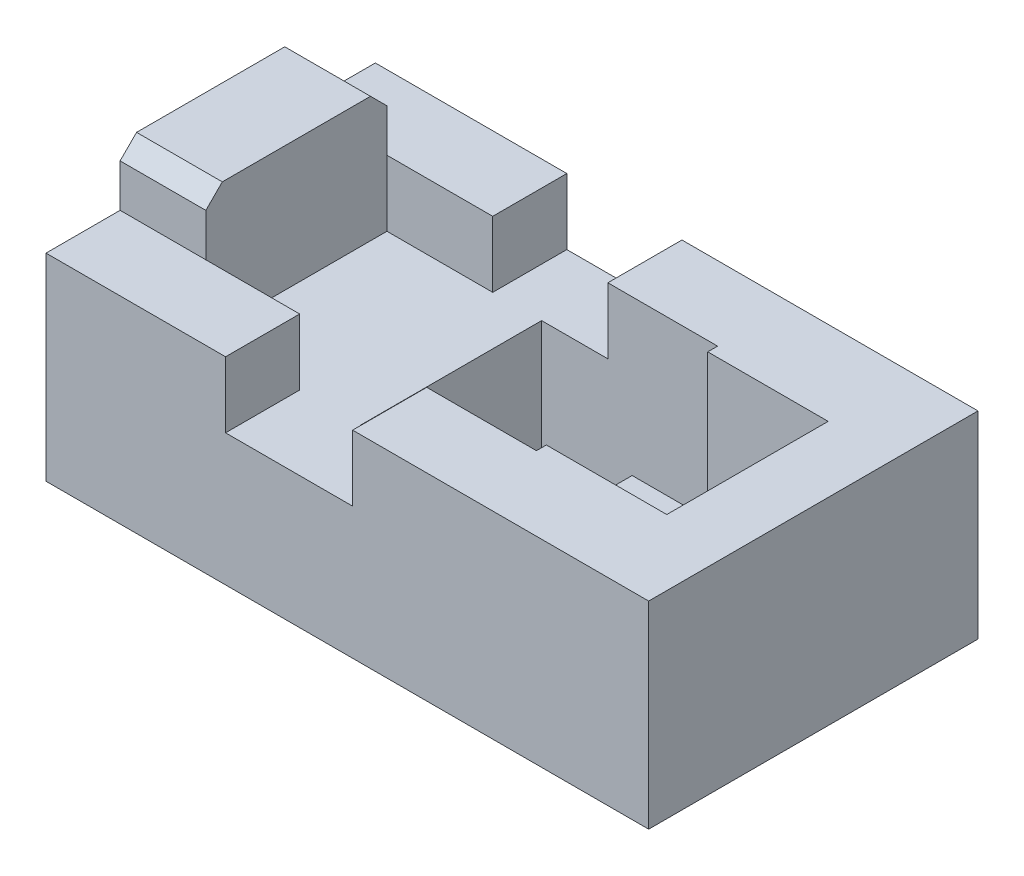
ISO-10303-21;
HEADER;
FILE_DESCRIPTION(('STEP AP214'),'2;1');
FILE_NAME('part.step','',(''),(''),'','','');
FILE_SCHEMA(('AUTOMOTIVE_DESIGN { 1 0 10303 214 1 1 1 1 }'));
ENDSEC;
DATA;
#1=APPLICATION_CONTEXT('core data for automotive mechanical design processes');
#2=APPLICATION_PROTOCOL_DEFINITION('international standard','automotive_design',2000,#1);
#3=PRODUCT_CONTEXT('',#1,'mechanical');
#4=PRODUCT('Part','Part','',(#3));
#5=PRODUCT_RELATED_PRODUCT_CATEGORY('part','',(#4));
#6=PRODUCT_DEFINITION_FORMATION('','',#4);
#7=PRODUCT_DEFINITION_CONTEXT('part definition',#1,'design');
#8=PRODUCT_DEFINITION('design','',#6,#7);
#9=PRODUCT_DEFINITION_SHAPE('','',#8);
#10=(LENGTH_UNIT() NAMED_UNIT(*) SI_UNIT(.MILLI.,.METRE.));
#11=(NAMED_UNIT(*) PLANE_ANGLE_UNIT() SI_UNIT($,.RADIAN.));
#12=(NAMED_UNIT(*) SI_UNIT($,.STERADIAN.) SOLID_ANGLE_UNIT());
#13=UNCERTAINTY_MEASURE_WITH_UNIT(LENGTH_MEASURE(1.E-05),#10,'distance_accuracy_value','');
#14=(GEOMETRIC_REPRESENTATION_CONTEXT(3) GLOBAL_UNCERTAINTY_ASSIGNED_CONTEXT((#13)) GLOBAL_UNIT_ASSIGNED_CONTEXT((#10,
#11,#12)) REPRESENTATION_CONTEXT('',''));
#15=CARTESIAN_POINT('',(0.,0.,0.));
#16=DIRECTION('',(0.,0.,1.));
#17=DIRECTION('',(1.,0.,0.));
#18=AXIS2_PLACEMENT_3D('',#15,#16,#17);
#19=CARTESIAN_POINT('',(0.,0.,0.));
#20=DIRECTION('',(0.,-1.,0.));
#21=DIRECTION('',(0.,0.,-1.));
#22=AXIS2_PLACEMENT_3D('',#19,#20,#21);
#23=PLANE('',#22);
#24=DIRECTION('',(0.,0.,1.));
#25=VECTOR('',#24,1.);
#26=CARTESIAN_POINT('',(0.750000000000002,0.,-2.75));
#27=LINE('',#26,#25);
#28=CARTESIAN_POINT('',(0.750000000000002,0.,-2.75));
#29=VERTEX_POINT('',#28);
#30=CARTESIAN_POINT('',(0.750000000000003,0.,2.75));
#31=VERTEX_POINT('',#30);
#32=EDGE_CURVE('E485',#29,#31,#27,.T.);
#33=ORIENTED_EDGE('',*,*,#32,.T.);
#34=DIRECTION('',(1.,0.,0.));
#35=VECTOR('',#34,1.);
#36=CARTESIAN_POINT('',(0.750000000000003,0.,2.75));
#37=LINE('',#36,#35);
#38=CARTESIAN_POINT('',(2.49790103791758,0.,2.75));
#39=VERTEX_POINT('',#38);
#40=EDGE_CURVE('E489',#31,#39,#37,.T.);
#41=ORIENTED_EDGE('',*,*,#40,.T.);
#42=DIRECTION('',(0.,0.,-1.));
#43=VECTOR('',#42,1.);
#44=CARTESIAN_POINT('',(2.49790103791758,0.,-2.75));
#45=LINE('',#44,#43);
#46=CARTESIAN_POINT('',(2.49790103791758,0.,-2.75));
#47=VERTEX_POINT('',#46);
#48=EDGE_CURVE('E493',#39,#47,#45,.T.);
#49=ORIENTED_EDGE('',*,*,#48,.T.);
#50=DIRECTION('',(-1.,0.,0.));
#51=VECTOR('',#50,1.);
#52=CARTESIAN_POINT('',(0.750000000000002,0.,-2.75));
#53=LINE('',#52,#51);
#54=EDGE_CURVE('E497',#47,#29,#53,.T.);
#55=ORIENTED_EDGE('',*,*,#54,.T.);
#56=EDGE_LOOP('',(#33,#41,#49,#55));
#57=FACE_BOUND('',#56,.T.);
#58=DIRECTION('',(1.,0.,0.));
#59=VECTOR('',#58,1.);
#60=CARTESIAN_POINT('',(-9.75,0.,5.));
#61=LINE('',#60,#59);
#62=CARTESIAN_POINT('',(-6.55,0.,5.));
#63=VERTEX_POINT('',#62);
#64=CARTESIAN_POINT('',(11.75,0.,5.));
#65=VERTEX_POINT('',#64);
#66=EDGE_CURVE('E550',#63,#65,#61,.T.);
#67=ORIENTED_EDGE('',*,*,#66,.F.);
#68=DIRECTION('',(0.,0.,-1.));
#69=VECTOR('',#68,1.);
#70=CARTESIAN_POINT('',(-6.55,0.,-5.));
#71=LINE('',#70,#69);
#72=CARTESIAN_POINT('',(-6.55,0.,-5.));
#73=VERTEX_POINT('',#72);
#74=EDGE_CURVE('E510',#63,#73,#71,.T.);
#75=ORIENTED_EDGE('',*,*,#74,.T.);
#76=DIRECTION('',(-1.,0.,0.));
#77=VECTOR('',#76,1.);
#78=CARTESIAN_POINT('',(-9.75,0.,-5.));
#79=LINE('',#78,#77);
#80=CARTESIAN_POINT('',(11.75,0.,-5.));
#81=VERTEX_POINT('',#80);
#82=EDGE_CURVE('E541',#81,#73,#79,.T.);
#83=ORIENTED_EDGE('',*,*,#82,.F.);
#84=DIRECTION('',(0.,0.,-1.));
#85=VECTOR('',#84,1.);
#86=CARTESIAN_POINT('',(11.75,0.,-5.));
#87=LINE('',#86,#85);
#88=EDGE_CURVE('E481',#65,#81,#87,.T.);
#89=ORIENTED_EDGE('',*,*,#88,.F.);
#90=EDGE_LOOP('',(#67,#75,#83,#89));
#91=FACE_BOUND('',#90,.T.);
#92=ADVANCED_FACE('F45',(#57,#91),#23,.T.);
#93=CARTESIAN_POINT('',(0.,4.,0.));
#94=DIRECTION('',(0.,-1.,0.));
#95=DIRECTION('',(0.,0.,-1.));
#96=AXIS2_PLACEMENT_3D('',#93,#94,#95);
#97=PLANE('',#96);
#98=DIRECTION('',(0.,0.,-1.));
#99=VECTOR('',#98,1.);
#100=CARTESIAN_POINT('',(-3.94664085234808,4.,-2.75));
#101=LINE('',#100,#99);
#102=CARTESIAN_POINT('',(-3.94664085234808,4.,2.75));
#103=VERTEX_POINT('',#102);
#104=CARTESIAN_POINT('',(-3.94664085234808,4.,-2.75));
#105=VERTEX_POINT('',#104);
#106=EDGE_CURVE('E618',#103,#105,#101,.T.);
#107=ORIENTED_EDGE('',*,*,#106,.F.);
#108=DIRECTION('',(-1.,0.,0.));
#109=VECTOR('',#108,1.);
#110=CARTESIAN_POINT('',(-6.55,4.,2.75));
#111=LINE('',#110,#109);
#112=CARTESIAN_POINT('',(-1.09759037141544,4.,2.75));
#113=VERTEX_POINT('',#112);
#114=EDGE_CURVE('E283',#113,#103,#111,.T.);
#115=ORIENTED_EDGE('',*,*,#114,.F.);
#116=DIRECTION('',(0.,0.,-1.));
#117=VECTOR('',#116,1.);
#118=CARTESIAN_POINT('',(-1.09759037141544,4.,5.));
#119=LINE('',#118,#117);
#120=CARTESIAN_POINT('',(-1.09759037141544,4.,5.));
#121=VERTEX_POINT('',#120);
#122=EDGE_CURVE('E299',#121,#113,#119,.T.);
#123=ORIENTED_EDGE('',*,*,#122,.F.);
#124=DIRECTION('',(1.,0.,0.));
#125=VECTOR('',#124,1.);
#126=CARTESIAN_POINT('',(-9.75,4.,5.));
#127=LINE('',#126,#125);
#128=CARTESIAN_POINT('',(2.7606994651137,4.,5.));
#129=VERTEX_POINT('',#128);
#130=EDGE_CURVE('E549',#121,#129,#127,.T.);
#131=ORIENTED_EDGE('',*,*,#130,.T.);
#132=DIRECTION('',(0.,0.,1.));
#133=VECTOR('',#132,1.);
#134=CARTESIAN_POINT('',(2.7606994651137,4.,5.));
#135=LINE('',#134,#133);
#136=CARTESIAN_POINT('',(2.7606994651137,4.,2.75));
#137=VERTEX_POINT('',#136);
#138=EDGE_CURVE('E411',#137,#129,#135,.T.);
#139=ORIENTED_EDGE('',*,*,#138,.F.);
#140=DIRECTION('',(1.,0.,0.));
#141=VECTOR('',#140,1.);
#142=CARTESIAN_POINT('',(9.75,4.,2.75));
#143=LINE('',#142,#141);
#144=CARTESIAN_POINT('',(0.750000000000002,4.,2.75));
#145=VERTEX_POINT('',#144);
#146=EDGE_CURVE('E524',#145,#137,#143,.T.);
#147=ORIENTED_EDGE('',*,*,#146,.F.);
#148=DIRECTION('',(0.,0.,1.));
#149=VECTOR('',#148,1.);
#150=CARTESIAN_POINT('',(0.750000000000002,4.,-2.75));
#151=LINE('',#150,#149);
#152=CARTESIAN_POINT('',(0.750000000000002,4.,-2.75));
#153=VERTEX_POINT('',#152);
#154=EDGE_CURVE('E531',#153,#145,#151,.T.);
#155=ORIENTED_EDGE('',*,*,#154,.F.);
#156=DIRECTION('',(-1.,0.,0.));
#157=VECTOR('',#156,1.);
#158=CARTESIAN_POINT('',(9.75,4.,-2.75));
#159=LINE('',#158,#157);
#160=CARTESIAN_POINT('',(2.7606994651137,4.,-2.75));
#161=VERTEX_POINT('',#160);
#162=EDGE_CURVE('E517',#161,#153,#159,.T.);
#163=ORIENTED_EDGE('',*,*,#162,.F.);
#164=DIRECTION('',(0.,0.,1.));
#165=VECTOR('',#164,1.);
#166=CARTESIAN_POINT('',(2.7606994651137,4.,-2.75));
#167=LINE('',#166,#165);
#168=CARTESIAN_POINT('',(2.7606994651137,4.,-5.));
#169=VERTEX_POINT('',#168);
#170=EDGE_CURVE('E417',#169,#161,#167,.T.);
#171=ORIENTED_EDGE('',*,*,#170,.F.);
#172=DIRECTION('',(-1.,0.,0.));
#173=VECTOR('',#172,1.);
#174=CARTESIAN_POINT('',(-9.75,4.,-5.));
#175=LINE('',#174,#173);
#176=CARTESIAN_POINT('',(-0.735029030067835,4.,-5.));
#177=VERTEX_POINT('',#176);
#178=EDGE_CURVE('E545',#169,#177,#175,.T.);
#179=ORIENTED_EDGE('',*,*,#178,.T.);
#180=DIRECTION('',(0.,0.,-1.));
#181=VECTOR('',#180,1.);
#182=CARTESIAN_POINT('',(-0.735029030067835,4.,-5.));
#183=LINE('',#182,#181);
#184=CARTESIAN_POINT('',(-0.735029030067835,4.,-2.75));
#185=VERTEX_POINT('',#184);
#186=EDGE_CURVE('E330',#185,#177,#183,.T.);
#187=ORIENTED_EDGE('',*,*,#186,.F.);
#188=DIRECTION('',(1.,0.,0.));
#189=VECTOR('',#188,1.);
#190=CARTESIAN_POINT('',(-6.55,4.,-2.75));
#191=LINE('',#190,#189);
#192=EDGE_CURVE('E303',#105,#185,#191,.T.);
#193=ORIENTED_EDGE('',*,*,#192,.F.);
#194=EDGE_LOOP('',(#107,#115,#123,#131,#139,#147,#155,#163,#171,#179,#187,#193));
#195=FACE_BOUND('',#194,.T.);
#196=ADVANCED_FACE('F644',(#195),#97,.F.);
#197=CARTESIAN_POINT('',(-6.55,12.2350932135096,-2.75));
#198=DIRECTION('',(0.,0.,-1.));
#199=DIRECTION('',(-1.,0.,0.));
#200=AXIS2_PLACEMENT_3D('',#197,#198,#199);
#201=PLANE('',#200);
#202=DIRECTION('',(0.,-1.,0.));
#203=VECTOR('',#202,1.);
#204=CARTESIAN_POINT('',(-3.94664085234808,7.8,-2.75));
#205=LINE('',#204,#203);
#206=CARTESIAN_POINT('',(-3.94664085234808,6.,-2.75));
#207=VERTEX_POINT('',#206);
#208=EDGE_CURVE('E613',#207,#105,#205,.T.);
#209=ORIENTED_EDGE('',*,*,#208,.T.);
#210=ORIENTED_EDGE('',*,*,#192,.T.);
#211=DIRECTION('',(0.,-1.,0.));
#212=VECTOR('',#211,1.);
#213=CARTESIAN_POINT('',(-0.735029030067835,12.2350932135096,-2.75));
#214=LINE('',#213,#212);
#215=CARTESIAN_POINT('',(-0.735029030067835,6.,-2.75));
#216=VERTEX_POINT('',#215);
#217=EDGE_CURVE('E337',#216,#185,#214,.T.);
#218=ORIENTED_EDGE('',*,*,#217,.F.);
#219=DIRECTION('',(-1.,0.,0.));
#220=VECTOR('',#219,1.);
#221=CARTESIAN_POINT('',(-6.55,6.,-2.75));
#222=LINE('',#221,#220);
#223=EDGE_CURVE('E319',#216,#207,#222,.T.);
#224=ORIENTED_EDGE('',*,*,#223,.T.);
#225=EDGE_LOOP('',(#209,#210,#218,#224));
#226=FACE_BOUND('',#225,.T.);
#227=ADVANCED_FACE('F626',(#226),#201,.F.);
#228=CARTESIAN_POINT('',(-6.55,12.2350932135096,2.75));
#229=DIRECTION('',(0.,0.,1.));
#230=DIRECTION('',(1.,0.,0.));
#231=AXIS2_PLACEMENT_3D('',#228,#229,#230);
#232=PLANE('',#231);
#233=DIRECTION('',(0.,-1.,0.));
#234=VECTOR('',#233,1.);
#235=CARTESIAN_POINT('',(-3.94664085234808,7.8,2.75));
#236=LINE('',#235,#234);
#237=CARTESIAN_POINT('',(-3.94664085234808,6.,2.75));
#238=VERTEX_POINT('',#237);
#239=EDGE_CURVE('E259',#238,#103,#236,.T.);
#240=ORIENTED_EDGE('',*,*,#239,.F.);
#241=DIRECTION('',(1.,0.,0.));
#242=VECTOR('',#241,1.);
#243=CARTESIAN_POINT('',(-6.55,6.,2.75));
#244=LINE('',#243,#242);
#245=CARTESIAN_POINT('',(-1.09759037141544,6.,2.75));
#246=VERTEX_POINT('',#245);
#247=EDGE_CURVE('E269',#238,#246,#244,.T.);
#248=ORIENTED_EDGE('',*,*,#247,.T.);
#249=DIRECTION('',(0.,-1.,0.));
#250=VECTOR('',#249,1.);
#251=CARTESIAN_POINT('',(-1.09759037141544,12.2350932135096,2.75));
#252=LINE('',#251,#250);
#253=EDGE_CURVE('E291',#246,#113,#252,.T.);
#254=ORIENTED_EDGE('',*,*,#253,.T.);
#255=ORIENTED_EDGE('',*,*,#114,.T.);
#256=EDGE_LOOP('',(#240,#248,#254,#255));
#257=FACE_BOUND('',#256,.T.);
#258=ADVANCED_FACE('F281',(#257),#232,.F.);
#259=CARTESIAN_POINT('',(9.75,1.3,2.75));
#260=DIRECTION('',(0.,0.,1.));
#261=DIRECTION('',(1.,0.,0.));
#262=AXIS2_PLACEMENT_3D('',#259,#260,#261);
#263=PLANE('',#262);
#264=DIRECTION('',(-1.,0.,0.));
#265=VECTOR('',#264,1.);
#266=CARTESIAN_POINT('',(2.7606994651137,6.,2.75));
#267=LINE('',#266,#265);
#268=CARTESIAN_POINT('',(6.09259643383098,6.,2.75));
#269=VERTEX_POINT('',#268);
#270=CARTESIAN_POINT('',(2.7606994651137,6.,2.75));
#271=VERTEX_POINT('',#270);
#272=EDGE_CURVE('E421',#269,#271,#267,.T.);
#273=ORIENTED_EDGE('',*,*,#272,.F.);
#274=DIRECTION('',(0.,1.,0.));
#275=VECTOR('',#274,1.);
#276=CARTESIAN_POINT('',(6.09259643383098,0.,2.75));
#277=LINE('',#276,#275);
#278=CARTESIAN_POINT('',(6.09259643383098,1.3,2.75));
#279=VERTEX_POINT('',#278);
#280=EDGE_CURVE('E327',#279,#269,#277,.T.);
#281=ORIENTED_EDGE('',*,*,#280,.F.);
#282=DIRECTION('',(1.,0.,0.));
#283=VECTOR('',#282,1.);
#284=CARTESIAN_POINT('',(9.75,1.3,2.75));
#285=LINE('',#284,#283);
#286=CARTESIAN_POINT('',(3.49790103791758,1.3,2.75));
#287=VERTEX_POINT('',#286);
#288=EDGE_CURVE('E523',#287,#279,#285,.T.);
#289=ORIENTED_EDGE('',*,*,#288,.F.);
#290=DIRECTION('',(0.707106781186547,0.707106781186547,0.));
#291=VECTOR('',#290,1.);
#292=CARTESIAN_POINT('',(6.62395051895879,4.42604948104121,2.75));
#293=LINE('',#292,#291);
#294=CARTESIAN_POINT('',(2.49790103791758,0.299999999999999,2.75));
#295=VERTEX_POINT('',#294);
#296=EDGE_CURVE('E569',#287,#295,#293,.F.);
#297=ORIENTED_EDGE('',*,*,#296,.T.);
#298=DIRECTION('',(0.,1.,0.));
#299=VECTOR('',#298,1.);
#300=CARTESIAN_POINT('',(2.49790103791758,0.,2.75));
#301=LINE('',#300,#299);
#302=EDGE_CURVE('E501',#39,#295,#301,.T.);
#303=ORIENTED_EDGE('',*,*,#302,.F.);
#304=ORIENTED_EDGE('',*,*,#40,.F.);
#305=DIRECTION('',(0.,1.,0.));
#306=VECTOR('',#305,1.);
#307=CARTESIAN_POINT('',(0.750000000000002,1.3,2.75));
#308=LINE('',#307,#306);
#309=EDGE_CURVE('E538',#31,#145,#308,.T.);
#310=ORIENTED_EDGE('',*,*,#309,.T.);
#311=ORIENTED_EDGE('',*,*,#146,.T.);
#312=DIRECTION('',(0.,-1.,0.));
#313=VECTOR('',#312,1.);
#314=CARTESIAN_POINT('',(2.7606994651137,6.,2.75));
#315=LINE('',#314,#313);
#316=EDGE_CURVE('E459',#271,#137,#315,.T.);
#317=ORIENTED_EDGE('',*,*,#316,.F.);
#318=EDGE_LOOP('',(#273,#281,#289,#297,#303,#304,#310,#311,#317));
#319=FACE_BOUND('',#318,.T.);
#320=ADVANCED_FACE('F696',(#319),#263,.F.);
#321=CARTESIAN_POINT('',(9.75,1.3,-2.75));
#322=DIRECTION('',(0.,0.,-1.));
#323=DIRECTION('',(-1.,0.,0.));
#324=AXIS2_PLACEMENT_3D('',#321,#322,#323);
#325=PLANE('',#324);
#326=DIRECTION('',(-1.,0.,0.));
#327=VECTOR('',#326,1.);
#328=CARTESIAN_POINT('',(9.75,1.3,-2.75));
#329=LINE('',#328,#327);
#330=CARTESIAN_POINT('',(6.09259643383098,1.3,-2.75));
#331=VERTEX_POINT('',#330);
#332=CARTESIAN_POINT('',(3.49790103791758,1.3,-2.75));
#333=VERTEX_POINT('',#332);
#334=EDGE_CURVE('E520',#331,#333,#329,.T.);
#335=ORIENTED_EDGE('',*,*,#334,.F.);
#336=DIRECTION('',(0.,1.,0.));
#337=VECTOR('',#336,1.);
#338=CARTESIAN_POINT('',(6.09259643383098,0.,-2.75));
#339=LINE('',#338,#337);
#340=CARTESIAN_POINT('',(6.09259643383098,6.,-2.75));
#341=VERTEX_POINT('',#340);
#342=EDGE_CURVE('E384',#331,#341,#339,.T.);
#343=ORIENTED_EDGE('',*,*,#342,.T.);
#344=DIRECTION('',(1.,0.,0.));
#345=VECTOR('',#344,1.);
#346=CARTESIAN_POINT('',(9.75,6.,-2.75));
#347=LINE('',#346,#345);
#348=CARTESIAN_POINT('',(2.7606994651137,6.,-2.75));
#349=VERTEX_POINT('',#348);
#350=EDGE_CURVE('E412',#349,#341,#347,.T.);
#351=ORIENTED_EDGE('',*,*,#350,.F.);
#352=DIRECTION('',(0.,-1.,0.));
#353=VECTOR('',#352,1.);
#354=CARTESIAN_POINT('',(2.7606994651137,6.,-2.75));
#355=LINE('',#354,#353);
#356=EDGE_CURVE('E441',#349,#161,#355,.T.);
#357=ORIENTED_EDGE('',*,*,#356,.T.);
#358=ORIENTED_EDGE('',*,*,#162,.T.);
#359=DIRECTION('',(0.,1.,0.));
#360=VECTOR('',#359,1.);
#361=CARTESIAN_POINT('',(0.750000000000002,1.3,-2.75));
#362=LINE('',#361,#360);
#363=EDGE_CURVE('E528',#29,#153,#362,.T.);
#364=ORIENTED_EDGE('',*,*,#363,.F.);
#365=ORIENTED_EDGE('',*,*,#54,.F.);
#366=DIRECTION('',(0.,1.,0.));
#367=VECTOR('',#366,1.);
#368=CARTESIAN_POINT('',(2.49790103791758,0.,-2.75));
#369=LINE('',#368,#367);
#370=CARTESIAN_POINT('',(2.49790103791758,0.299999999999999,-2.75));
#371=VERTEX_POINT('',#370);
#372=EDGE_CURVE('E502',#47,#371,#369,.T.);
#373=ORIENTED_EDGE('',*,*,#372,.T.);
#374=DIRECTION('',(-0.707106781186547,-0.707106781186547,0.));
#375=VECTOR('',#374,1.);
#376=CARTESIAN_POINT('',(6.62395051895879,4.42604948104121,-2.75));
#377=LINE('',#376,#375);
#378=EDGE_CURVE('E565',#371,#333,#377,.F.);
#379=ORIENTED_EDGE('',*,*,#378,.T.);
#380=EDGE_LOOP('',(#335,#343,#351,#357,#358,#364,#365,#373,#379));
#381=FACE_BOUND('',#380,.T.);
#382=ADVANCED_FACE('F655',(#381),#325,.F.);
#383=CARTESIAN_POINT('',(0.,1.3,0.));
#384=DIRECTION('',(0.,-1.,0.));
#385=DIRECTION('',(0.,0.,-1.));
#386=AXIS2_PLACEMENT_3D('',#383,#384,#385);
#387=PLANE('',#386);
#388=ORIENTED_EDGE('',*,*,#288,.T.);
#389=DIRECTION('',(0.,0.,-1.));
#390=VECTOR('',#389,1.);
#391=CARTESIAN_POINT('',(6.09259643383098,1.3,0.));
#392=LINE('',#391,#390);
#393=CARTESIAN_POINT('',(6.09259643383098,1.3,2.45));
#394=VERTEX_POINT('',#393);
#395=EDGE_CURVE('E373',#279,#394,#392,.T.);
#396=ORIENTED_EDGE('',*,*,#395,.T.);
#397=DIRECTION('',(1.,0.,0.));
#398=VECTOR('',#397,1.);
#399=CARTESIAN_POINT('',(0.,1.3,2.45));
#400=LINE('',#399,#398);
#401=CARTESIAN_POINT('',(8.00292213727261,1.3,2.45));
#402=VERTEX_POINT('',#401);
#403=EDGE_CURVE('E369',#394,#402,#400,.T.);
#404=ORIENTED_EDGE('',*,*,#403,.T.);
#405=DIRECTION('',(0.,0.,1.));
#406=VECTOR('',#405,1.);
#407=CARTESIAN_POINT('',(8.00292213727261,1.3,-2.75));
#408=LINE('',#407,#406);
#409=CARTESIAN_POINT('',(8.00292213727261,1.3,-2.45));
#410=VERTEX_POINT('',#409);
#411=EDGE_CURVE('E463',#410,#402,#408,.T.);
#412=ORIENTED_EDGE('',*,*,#411,.F.);
#413=DIRECTION('',(-1.,0.,0.));
#414=VECTOR('',#413,1.);
#415=CARTESIAN_POINT('',(0.,1.3,-2.45));
#416=LINE('',#415,#414);
#417=CARTESIAN_POINT('',(6.09259643383098,1.3,-2.45));
#418=VERTEX_POINT('',#417);
#419=EDGE_CURVE('E407',#410,#418,#416,.T.);
#420=ORIENTED_EDGE('',*,*,#419,.T.);
#421=DIRECTION('',(0.,0.,-1.));
#422=VECTOR('',#421,1.);
#423=CARTESIAN_POINT('',(6.09259643383098,1.3,0.));
#424=LINE('',#423,#422);
#425=EDGE_CURVE('E389',#418,#331,#424,.T.);
#426=ORIENTED_EDGE('',*,*,#425,.T.);
#427=ORIENTED_EDGE('',*,*,#334,.T.);
#428=DIRECTION('',(0.,0.,1.));
#429=VECTOR('',#428,1.);
#430=CARTESIAN_POINT('',(3.49790103791758,1.3,0.));
#431=LINE('',#430,#429);
#432=EDGE_CURVE('E562',#333,#287,#431,.T.);
#433=ORIENTED_EDGE('',*,*,#432,.T.);
#434=EDGE_LOOP('',(#388,#396,#404,#412,#420,#426,#427,#433));
#435=FACE_BOUND('',#434,.T.);
#436=ADVANCED_FACE('F746',(#435),#387,.F.);
#437=CARTESIAN_POINT('',(9.75,0.,0.));
#438=DIRECTION('',(1.,0.,0.));
#439=DIRECTION('',(0.,0.,-1.));
#440=AXIS2_PLACEMENT_3D('',#437,#438,#439);
#441=PLANE('',#440);
#442=DIRECTION('',(0.,0.,-1.));
#443=VECTOR('',#442,1.);
#444=CARTESIAN_POINT('',(9.75,2.8,-2.75));
#445=LINE('',#444,#443);
#446=CARTESIAN_POINT('',(9.75,2.8,2.45));
#447=VERTEX_POINT('',#446);
#448=CARTESIAN_POINT('',(9.75,2.8,-2.45));
#449=VERTEX_POINT('',#448);
#450=EDGE_CURVE('E464',#447,#449,#445,.T.);
#451=ORIENTED_EDGE('',*,*,#450,.F.);
#452=DIRECTION('',(0.,1.,0.));
#453=VECTOR('',#452,1.);
#454=CARTESIAN_POINT('',(9.75,0.,2.45));
#455=LINE('',#454,#453);
#456=CARTESIAN_POINT('',(9.75,6.,2.45));
#457=VERTEX_POINT('',#456);
#458=EDGE_CURVE('E344',#447,#457,#455,.T.);
#459=ORIENTED_EDGE('',*,*,#458,.T.);
#460=DIRECTION('',(0.,0.,1.));
#461=VECTOR('',#460,1.);
#462=CARTESIAN_POINT('',(9.75,6.,2.75));
#463=LINE('',#462,#461);
#464=CARTESIAN_POINT('',(9.75,6.,-2.45));
#465=VERTEX_POINT('',#464);
#466=EDGE_CURVE('E416',#465,#457,#463,.T.);
#467=ORIENTED_EDGE('',*,*,#466,.F.);
#468=DIRECTION('',(0.,1.,0.));
#469=VECTOR('',#468,1.);
#470=CARTESIAN_POINT('',(9.75,0.,-2.45));
#471=LINE('',#470,#469);
#472=EDGE_CURVE('E385',#449,#465,#471,.T.);
#473=ORIENTED_EDGE('',*,*,#472,.F.);
#474=EDGE_LOOP('',(#451,#459,#467,#473));
#475=FACE_BOUND('',#474,.T.);
#476=ADVANCED_FACE('F664',(#475),#441,.F.);
#477=CARTESIAN_POINT('',(-9.75,4.,-5.));
#478=DIRECTION('',(0.,0.,1.));
#479=DIRECTION('',(1.,0.,0.));
#480=AXIS2_PLACEMENT_3D('',#477,#478,#479);
#481=PLANE('',#480);
#482=ORIENTED_EDGE('',*,*,#82,.T.);
#483=DIRECTION('',(0.,1.,0.));
#484=VECTOR('',#483,1.);
#485=CARTESIAN_POINT('',(-6.55,0.,-5.));
#486=LINE('',#485,#484);
#487=CARTESIAN_POINT('',(-6.55,6.,-5.));
#488=VERTEX_POINT('',#487);
#489=EDGE_CURVE('E514',#73,#488,#486,.T.);
#490=ORIENTED_EDGE('',*,*,#489,.T.);
#491=DIRECTION('',(1.,0.,0.));
#492=VECTOR('',#491,1.);
#493=CARTESIAN_POINT('',(-6.55,6.,-5.));
#494=LINE('',#493,#492);
#495=CARTESIAN_POINT('',(-0.735029030067835,6.,-5.));
#496=VERTEX_POINT('',#495);
#497=EDGE_CURVE('E318',#488,#496,#494,.T.);
#498=ORIENTED_EDGE('',*,*,#497,.T.);
#499=DIRECTION('',(0.,-1.,0.));
#500=VECTOR('',#499,1.);
#501=CARTESIAN_POINT('',(-0.735029030067835,12.2350932135096,-5.));
#502=LINE('',#501,#500);
#503=EDGE_CURVE('E334',#496,#177,#502,.T.);
#504=ORIENTED_EDGE('',*,*,#503,.T.);
#505=ORIENTED_EDGE('',*,*,#178,.F.);
#506=DIRECTION('',(0.,-1.,0.));
#507=VECTOR('',#506,1.);
#508=CARTESIAN_POINT('',(2.7606994651137,6.,-5.));
#509=LINE('',#508,#507);
#510=CARTESIAN_POINT('',(2.7606994651137,6.,-5.));
#511=VERTEX_POINT('',#510);
#512=EDGE_CURVE('E451',#511,#169,#509,.T.);
#513=ORIENTED_EDGE('',*,*,#512,.F.);
#514=DIRECTION('',(-1.,0.,0.));
#515=VECTOR('',#514,1.);
#516=CARTESIAN_POINT('',(2.7606994651137,6.,-5.));
#517=LINE('',#516,#515);
#518=CARTESIAN_POINT('',(11.75,6.,-5.));
#519=VERTEX_POINT('',#518);
#520=EDGE_CURVE('E435',#519,#511,#517,.T.);
#521=ORIENTED_EDGE('',*,*,#520,.F.);
#522=DIRECTION('',(0.,1.,0.));
#523=VECTOR('',#522,1.);
#524=CARTESIAN_POINT('',(11.75,0.,-5.));
#525=LINE('',#524,#523);
#526=EDGE_CURVE('E471',#81,#519,#525,.T.);
#527=ORIENTED_EDGE('',*,*,#526,.F.);
#528=EDGE_LOOP('',(#482,#490,#498,#504,#505,#513,#521,#527));
#529=FACE_BOUND('',#528,.T.);
#530=ADVANCED_FACE('F661',(#529),#481,.F.);
#531=CARTESIAN_POINT('',(-9.75,4.,5.));
#532=DIRECTION('',(0.,0.,-1.));
#533=DIRECTION('',(-1.,0.,0.));
#534=AXIS2_PLACEMENT_3D('',#531,#532,#533);
#535=PLANE('',#534);
#536=ORIENTED_EDGE('',*,*,#130,.F.);
#537=DIRECTION('',(0.,-1.,0.));
#538=VECTOR('',#537,1.);
#539=CARTESIAN_POINT('',(-1.09759037141544,12.2350932135096,5.));
#540=LINE('',#539,#538);
#541=CARTESIAN_POINT('',(-1.09759037141544,6.,5.));
#542=VERTEX_POINT('',#541);
#543=EDGE_CURVE('E289',#542,#121,#540,.T.);
#544=ORIENTED_EDGE('',*,*,#543,.F.);
#545=DIRECTION('',(-1.,0.,0.));
#546=VECTOR('',#545,1.);
#547=CARTESIAN_POINT('',(-6.55,6.,5.));
#548=LINE('',#547,#546);
#549=CARTESIAN_POINT('',(-6.55,6.,5.));
#550=VERTEX_POINT('',#549);
#551=EDGE_CURVE('E307',#542,#550,#548,.T.);
#552=ORIENTED_EDGE('',*,*,#551,.T.);
#553=DIRECTION('',(0.,1.,0.));
#554=VECTOR('',#553,1.);
#555=CARTESIAN_POINT('',(-6.55,0.,5.));
#556=LINE('',#555,#554);
#557=EDGE_CURVE('E506',#63,#550,#556,.T.);
#558=ORIENTED_EDGE('',*,*,#557,.F.);
#559=ORIENTED_EDGE('',*,*,#66,.T.);
#560=DIRECTION('',(0.,-1.,0.));
#561=VECTOR('',#560,1.);
#562=CARTESIAN_POINT('',(11.75,0.,5.));
#563=LINE('',#562,#561);
#564=CARTESIAN_POINT('',(11.75,6.,5.));
#565=VERTEX_POINT('',#564);
#566=EDGE_CURVE('E477',#565,#65,#563,.T.);
#567=ORIENTED_EDGE('',*,*,#566,.F.);
#568=DIRECTION('',(1.,0.,0.));
#569=VECTOR('',#568,1.);
#570=CARTESIAN_POINT('',(11.75,6.,5.));
#571=LINE('',#570,#569);
#572=CARTESIAN_POINT('',(2.7606994651137,6.,5.));
#573=VERTEX_POINT('',#572);
#574=EDGE_CURVE('E427',#573,#565,#571,.T.);
#575=ORIENTED_EDGE('',*,*,#574,.F.);
#576=DIRECTION('',(0.,-1.,0.));
#577=VECTOR('',#576,1.);
#578=CARTESIAN_POINT('',(2.7606994651137,6.,5.));
#579=LINE('',#578,#577);
#580=EDGE_CURVE('E455',#573,#129,#579,.T.);
#581=ORIENTED_EDGE('',*,*,#580,.T.);
#582=EDGE_LOOP('',(#536,#544,#552,#558,#559,#567,#575,#581));
#583=FACE_BOUND('',#582,.T.);
#584=ADVANCED_FACE('F639',(#583),#535,.F.);
#585=CARTESIAN_POINT('',(0.750000000000002,1.3,-2.75));
#586=DIRECTION('',(-1.,0.,0.));
#587=DIRECTION('',(0.,0.,1.));
#588=AXIS2_PLACEMENT_3D('',#585,#586,#587);
#589=PLANE('',#588);
#590=ORIENTED_EDGE('',*,*,#154,.T.);
#591=ORIENTED_EDGE('',*,*,#309,.F.);
#592=ORIENTED_EDGE('',*,*,#32,.F.);
#593=ORIENTED_EDGE('',*,*,#363,.T.);
#594=EDGE_LOOP('',(#590,#591,#592,#593));
#595=FACE_BOUND('',#594,.T.);
#596=ADVANCED_FACE('F660',(#595),#589,.F.);
#597=CARTESIAN_POINT('',(-6.55,0.,-5.));
#598=DIRECTION('',(1.,0.,0.));
#599=DIRECTION('',(0.,0.,-1.));
#600=AXIS2_PLACEMENT_3D('',#597,#598,#599);
#601=PLANE('',#600);
#602=DIRECTION('',(0.,0.,-1.));
#603=VECTOR('',#602,1.);
#604=CARTESIAN_POINT('',(-6.55,6.,5.));
#605=LINE('',#604,#603);
#606=CARTESIAN_POINT('',(-6.55,6.,2.75));
#607=VERTEX_POINT('',#606);
#608=EDGE_CURVE('E304',#550,#607,#605,.T.);
#609=ORIENTED_EDGE('',*,*,#608,.T.);
#610=DIRECTION('',(0.,-1.,0.));
#611=VECTOR('',#610,1.);
#612=CARTESIAN_POINT('',(-6.55,7.8,2.75));
#613=LINE('',#612,#611);
#614=CARTESIAN_POINT('',(-6.55,7.29999999999999,2.75));
#615=VERTEX_POINT('',#614);
#616=EDGE_CURVE('E264',#615,#607,#613,.T.);
#617=ORIENTED_EDGE('',*,*,#616,.F.);
#618=DIRECTION('',(0.,0.70710678118655,-0.707106781186545));
#619=VECTOR('',#618,1.);
#620=CARTESIAN_POINT('',(-6.55,7.8,2.25));
#621=LINE('',#620,#619);
#622=CARTESIAN_POINT('',(-6.55,7.8,2.24999999999999));
#623=VERTEX_POINT('',#622);
#624=EDGE_CURVE('E580',#615,#623,#621,.T.);
#625=ORIENTED_EDGE('',*,*,#624,.T.);
#626=DIRECTION('',(0.,0.,1.));
#627=VECTOR('',#626,1.);
#628=CARTESIAN_POINT('',(-6.55,7.8,-2.75));
#629=LINE('',#628,#627);
#630=CARTESIAN_POINT('',(-6.55,7.8,-2.25));
#631=VERTEX_POINT('',#630);
#632=EDGE_CURVE('E603',#631,#623,#629,.T.);
#633=ORIENTED_EDGE('',*,*,#632,.F.);
#634=DIRECTION('',(0.,-0.707106781186548,-0.707106781186547));
#635=VECTOR('',#634,1.);
#636=CARTESIAN_POINT('',(-6.55,7.8,-2.25));
#637=LINE('',#636,#635);
#638=CARTESIAN_POINT('',(-6.55,7.3,-2.75));
#639=VERTEX_POINT('',#638);
#640=EDGE_CURVE('E583',#631,#639,#637,.T.);
#641=ORIENTED_EDGE('',*,*,#640,.T.);
#642=DIRECTION('',(0.,-1.,0.));
#643=VECTOR('',#642,1.);
#644=CARTESIAN_POINT('',(-6.55,7.8,-2.75));
#645=LINE('',#644,#643);
#646=CARTESIAN_POINT('',(-6.55,6.,-2.75));
#647=VERTEX_POINT('',#646);
#648=EDGE_CURVE('E602',#639,#647,#645,.T.);
#649=ORIENTED_EDGE('',*,*,#648,.T.);
#650=DIRECTION('',(0.,0.,-1.));
#651=VECTOR('',#650,1.);
#652=CARTESIAN_POINT('',(-6.55,6.,-5.));
#653=LINE('',#652,#651);
#654=EDGE_CURVE('E323',#647,#488,#653,.T.);
#655=ORIENTED_EDGE('',*,*,#654,.T.);
#656=ORIENTED_EDGE('',*,*,#489,.F.);
#657=ORIENTED_EDGE('',*,*,#74,.F.);
#658=ORIENTED_EDGE('',*,*,#557,.T.);
#659=EDGE_LOOP('',(#609,#617,#625,#633,#641,#649,#655,#656,#657,#658));
#660=FACE_BOUND('',#659,.T.);
#661=ADVANCED_FACE('F607',(#660),#601,.F.);
#662=CARTESIAN_POINT('',(2.49790103791758,0.,-2.75));
#663=DIRECTION('',(1.,0.,0.));
#664=DIRECTION('',(0.,0.,-1.));
#665=AXIS2_PLACEMENT_3D('',#662,#663,#664);
#666=PLANE('',#665);
#667=ORIENTED_EDGE('',*,*,#302,.T.);
#668=DIRECTION('',(0.,0.,-1.));
#669=VECTOR('',#668,1.);
#670=CARTESIAN_POINT('',(2.49790103791758,0.299999999999999,-2.75));
#671=LINE('',#670,#669);
#672=EDGE_CURVE('E553',#295,#371,#671,.T.);
#673=ORIENTED_EDGE('',*,*,#672,.T.);
#674=ORIENTED_EDGE('',*,*,#372,.F.);
#675=ORIENTED_EDGE('',*,*,#48,.F.);
#676=EDGE_LOOP('',(#667,#673,#674,#675));
#677=FACE_BOUND('',#676,.T.);
#678=ADVANCED_FACE('F673',(#677),#666,.F.);
#679=CARTESIAN_POINT('',(2.49790103791758,0.299999999999999,-2.75));
#680=DIRECTION('',(0.707106781186547,-0.707106781186547,0.));
#681=DIRECTION('',(0.,0.,-1.));
#682=AXIS2_PLACEMENT_3D('',#679,#680,#681);
#683=PLANE('',#682);
#684=ORIENTED_EDGE('',*,*,#296,.F.);
#685=ORIENTED_EDGE('',*,*,#432,.F.);
#686=ORIENTED_EDGE('',*,*,#378,.F.);
#687=ORIENTED_EDGE('',*,*,#672,.F.);
#688=EDGE_LOOP('',(#684,#685,#686,#687));
#689=FACE_BOUND('',#688,.T.);
#690=ADVANCED_FACE('F667',(#689),#683,.F.);
#691=CARTESIAN_POINT('',(11.75,0.,0.));
#692=DIRECTION('',(1.,0.,0.));
#693=DIRECTION('',(0.,0.,-1.));
#694=AXIS2_PLACEMENT_3D('',#691,#692,#693);
#695=PLANE('',#694);
#696=ORIENTED_EDGE('',*,*,#526,.T.);
#697=DIRECTION('',(0.,0.,-1.));
#698=VECTOR('',#697,1.);
#699=CARTESIAN_POINT('',(11.75,6.,-5.));
#700=LINE('',#699,#698);
#701=EDGE_CURVE('E431',#565,#519,#700,.T.);
#702=ORIENTED_EDGE('',*,*,#701,.F.);
#703=ORIENTED_EDGE('',*,*,#566,.T.);
#704=ORIENTED_EDGE('',*,*,#88,.T.);
#705=EDGE_LOOP('',(#696,#702,#703,#704));
#706=FACE_BOUND('',#705,.T.);
#707=ADVANCED_FACE('F672',(#706),#695,.T.);
#708=CARTESIAN_POINT('',(8.00292213727261,2.8,-2.75));
#709=DIRECTION('',(1.,0.,0.));
#710=DIRECTION('',(0.,0.,-1.));
#711=AXIS2_PLACEMENT_3D('',#708,#709,#710);
#712=PLANE('',#711);
#713=ORIENTED_EDGE('',*,*,#411,.T.);
#714=DIRECTION('',(0.,1.,0.));
#715=VECTOR('',#714,1.);
#716=CARTESIAN_POINT('',(8.00292213727261,2.8,2.45));
#717=LINE('',#716,#715);
#718=CARTESIAN_POINT('',(8.00292213727261,2.8,2.45));
#719=VERTEX_POINT('',#718);
#720=EDGE_CURVE('E365',#402,#719,#717,.T.);
#721=ORIENTED_EDGE('',*,*,#720,.T.);
#722=DIRECTION('',(0.,0.,1.));
#723=VECTOR('',#722,1.);
#724=CARTESIAN_POINT('',(8.00292213727261,2.8,-2.75));
#725=LINE('',#724,#723);
#726=CARTESIAN_POINT('',(8.00292213727261,2.8,-2.45));
#727=VERTEX_POINT('',#726);
#728=EDGE_CURVE('E467',#727,#719,#725,.T.);
#729=ORIENTED_EDGE('',*,*,#728,.F.);
#730=DIRECTION('',(0.,-1.,0.));
#731=VECTOR('',#730,1.);
#732=CARTESIAN_POINT('',(8.00292213727261,2.8,-2.45));
#733=LINE('',#732,#731);
#734=EDGE_CURVE('E403',#727,#410,#733,.T.);
#735=ORIENTED_EDGE('',*,*,#734,.T.);
#736=EDGE_LOOP('',(#713,#721,#729,#735));
#737=FACE_BOUND('',#736,.T.);
#738=ADVANCED_FACE('F736',(#737),#712,.F.);
#739=CARTESIAN_POINT('',(0.,2.8,0.));
#740=DIRECTION('',(0.,-1.,0.));
#741=DIRECTION('',(0.,0.,-1.));
#742=AXIS2_PLACEMENT_3D('',#739,#740,#741);
#743=PLANE('',#742);
#744=ORIENTED_EDGE('',*,*,#728,.T.);
#745=DIRECTION('',(1.,0.,0.));
#746=VECTOR('',#745,1.);
#747=CARTESIAN_POINT('',(0.,2.8,2.45));
#748=LINE('',#747,#746);
#749=EDGE_CURVE('E361',#719,#447,#748,.T.);
#750=ORIENTED_EDGE('',*,*,#749,.T.);
#751=ORIENTED_EDGE('',*,*,#450,.T.);
#752=DIRECTION('',(-1.,0.,0.));
#753=VECTOR('',#752,1.);
#754=CARTESIAN_POINT('',(0.,2.8,-2.45));
#755=LINE('',#754,#753);
#756=EDGE_CURVE('E399',#449,#727,#755,.T.);
#757=ORIENTED_EDGE('',*,*,#756,.T.);
#758=EDGE_LOOP('',(#744,#750,#751,#757));
#759=FACE_BOUND('',#758,.T.);
#760=ADVANCED_FACE('F732',(#759),#743,.F.);
#761=CARTESIAN_POINT('',(2.7606994651137,6.,5.));
#762=DIRECTION('',(1.,0.,0.));
#763=DIRECTION('',(0.,0.,-1.));
#764=AXIS2_PLACEMENT_3D('',#761,#762,#763);
#765=PLANE('',#764);
#766=ORIENTED_EDGE('',*,*,#138,.T.);
#767=ORIENTED_EDGE('',*,*,#580,.F.);
#768=DIRECTION('',(0.,0.,1.));
#769=VECTOR('',#768,1.);
#770=CARTESIAN_POINT('',(2.7606994651137,6.,5.));
#771=LINE('',#770,#769);
#772=EDGE_CURVE('E424',#271,#573,#771,.T.);
#773=ORIENTED_EDGE('',*,*,#772,.F.);
#774=ORIENTED_EDGE('',*,*,#316,.T.);
#775=EDGE_LOOP('',(#766,#767,#773,#774));
#776=FACE_BOUND('',#775,.T.);
#777=ADVANCED_FACE('F728',(#776),#765,.F.);
#778=CARTESIAN_POINT('',(2.7606994651137,6.,-2.75));
#779=DIRECTION('',(1.,0.,0.));
#780=DIRECTION('',(0.,0.,-1.));
#781=AXIS2_PLACEMENT_3D('',#778,#779,#780);
#782=PLANE('',#781);
#783=ORIENTED_EDGE('',*,*,#170,.T.);
#784=ORIENTED_EDGE('',*,*,#356,.F.);
#785=DIRECTION('',(0.,0.,1.));
#786=VECTOR('',#785,1.);
#787=CARTESIAN_POINT('',(2.7606994651137,6.,-2.75));
#788=LINE('',#787,#786);
#789=EDGE_CURVE('E438',#511,#349,#788,.T.);
#790=ORIENTED_EDGE('',*,*,#789,.F.);
#791=ORIENTED_EDGE('',*,*,#512,.T.);
#792=EDGE_LOOP('',(#783,#784,#790,#791));
#793=FACE_BOUND('',#792,.T.);
#794=ADVANCED_FACE('F724',(#793),#782,.F.);
#795=CARTESIAN_POINT('',(0.,6.,0.));
#796=DIRECTION('',(0.,-1.,0.));
#797=DIRECTION('',(0.,0.,-1.));
#798=AXIS2_PLACEMENT_3D('',#795,#796,#797);
#799=PLANE('',#798);
#800=ORIENTED_EDGE('',*,*,#466,.T.);
#801=DIRECTION('',(-1.,0.,0.));
#802=VECTOR('',#801,1.);
#803=CARTESIAN_POINT('',(6.09259643383098,6.,2.45));
#804=LINE('',#803,#802);
#805=CARTESIAN_POINT('',(6.09259643383098,6.,2.45));
#806=VERTEX_POINT('',#805);
#807=EDGE_CURVE('E357',#457,#806,#804,.T.);
#808=ORIENTED_EDGE('',*,*,#807,.T.);
#809=DIRECTION('',(0.,0.,1.));
#810=VECTOR('',#809,1.);
#811=CARTESIAN_POINT('',(6.09259643383098,6.,2.75));
#812=LINE('',#811,#810);
#813=EDGE_CURVE('E348',#806,#269,#812,.T.);
#814=ORIENTED_EDGE('',*,*,#813,.T.);
#815=ORIENTED_EDGE('',*,*,#272,.T.);
#816=ORIENTED_EDGE('',*,*,#772,.T.);
#817=ORIENTED_EDGE('',*,*,#574,.T.);
#818=ORIENTED_EDGE('',*,*,#701,.T.);
#819=ORIENTED_EDGE('',*,*,#520,.T.);
#820=ORIENTED_EDGE('',*,*,#789,.T.);
#821=ORIENTED_EDGE('',*,*,#350,.T.);
#822=DIRECTION('',(0.,0.,1.));
#823=VECTOR('',#822,1.);
#824=CARTESIAN_POINT('',(6.09259643383098,6.,-2.45));
#825=LINE('',#824,#823);
#826=CARTESIAN_POINT('',(6.09259643383098,6.,-2.45));
#827=VERTEX_POINT('',#826);
#828=EDGE_CURVE('E377',#341,#827,#825,.T.);
#829=ORIENTED_EDGE('',*,*,#828,.T.);
#830=DIRECTION('',(1.,0.,0.));
#831=VECTOR('',#830,1.);
#832=CARTESIAN_POINT('',(9.75,6.,-2.45));
#833=LINE('',#832,#831);
#834=EDGE_CURVE('E381',#827,#465,#833,.T.);
#835=ORIENTED_EDGE('',*,*,#834,.T.);
#836=EDGE_LOOP('',(#800,#808,#814,#815,#816,#817,#818,#819,#820,#821,#829,#835));
#837=FACE_BOUND('',#836,.T.);
#838=ADVANCED_FACE('F717',(#837),#799,.F.);
#839=CARTESIAN_POINT('',(9.75,0.,-2.45));
#840=DIRECTION('',(0.,0.,1.));
#841=DIRECTION('',(1.,0.,0.));
#842=AXIS2_PLACEMENT_3D('',#839,#840,#841);
#843=PLANE('',#842);
#844=ORIENTED_EDGE('',*,*,#419,.F.);
#845=ORIENTED_EDGE('',*,*,#734,.F.);
#846=ORIENTED_EDGE('',*,*,#756,.F.);
#847=ORIENTED_EDGE('',*,*,#472,.T.);
#848=ORIENTED_EDGE('',*,*,#834,.F.);
#849=DIRECTION('',(0.,1.,0.));
#850=VECTOR('',#849,1.);
#851=CARTESIAN_POINT('',(6.09259643383098,0.,-2.45));
#852=LINE('',#851,#850);
#853=EDGE_CURVE('E390',#418,#827,#852,.T.);
#854=ORIENTED_EDGE('',*,*,#853,.F.);
#855=EDGE_LOOP('',(#844,#845,#846,#847,#848,#854));
#856=FACE_BOUND('',#855,.T.);
#857=ADVANCED_FACE('F714',(#856),#843,.T.);
#858=CARTESIAN_POINT('',(6.09259643383098,0.,-2.45));
#859=DIRECTION('',(-1.,0.,0.));
#860=DIRECTION('',(0.,0.,1.));
#861=AXIS2_PLACEMENT_3D('',#858,#859,#860);
#862=PLANE('',#861);
#863=ORIENTED_EDGE('',*,*,#425,.F.);
#864=ORIENTED_EDGE('',*,*,#853,.T.);
#865=ORIENTED_EDGE('',*,*,#828,.F.);
#866=ORIENTED_EDGE('',*,*,#342,.F.);
#867=EDGE_LOOP('',(#863,#864,#865,#866));
#868=FACE_BOUND('',#867,.T.);
#869=ADVANCED_FACE('F712',(#868),#862,.T.);
#870=CARTESIAN_POINT('',(6.09259643383098,0.,2.75));
#871=DIRECTION('',(-1.,0.,0.));
#872=DIRECTION('',(0.,0.,1.));
#873=AXIS2_PLACEMENT_3D('',#870,#871,#872);
#874=PLANE('',#873);
#875=ORIENTED_EDGE('',*,*,#395,.F.);
#876=ORIENTED_EDGE('',*,*,#280,.T.);
#877=ORIENTED_EDGE('',*,*,#813,.F.);
#878=DIRECTION('',(0.,1.,0.));
#879=VECTOR('',#878,1.);
#880=CARTESIAN_POINT('',(6.09259643383098,0.,2.45));
#881=LINE('',#880,#879);
#882=EDGE_CURVE('E349',#394,#806,#881,.T.);
#883=ORIENTED_EDGE('',*,*,#882,.F.);
#884=EDGE_LOOP('',(#875,#876,#877,#883));
#885=FACE_BOUND('',#884,.T.);
#886=ADVANCED_FACE('F708',(#885),#874,.T.);
#887=CARTESIAN_POINT('',(6.09259643383098,0.,2.45));
#888=DIRECTION('',(0.,0.,-1.));
#889=DIRECTION('',(-1.,0.,0.));
#890=AXIS2_PLACEMENT_3D('',#887,#888,#889);
#891=PLANE('',#890);
#892=ORIENTED_EDGE('',*,*,#403,.F.);
#893=ORIENTED_EDGE('',*,*,#882,.T.);
#894=ORIENTED_EDGE('',*,*,#807,.F.);
#895=ORIENTED_EDGE('',*,*,#458,.F.);
#896=ORIENTED_EDGE('',*,*,#749,.F.);
#897=ORIENTED_EDGE('',*,*,#720,.F.);
#898=EDGE_LOOP('',(#892,#893,#894,#895,#896,#897));
#899=FACE_BOUND('',#898,.T.);
#900=ADVANCED_FACE('F703',(#899),#891,.T.);
#901=CARTESIAN_POINT('',(-0.735029030067835,12.2350932135096,-5.));
#902=DIRECTION('',(-1.,0.,0.));
#903=DIRECTION('',(0.,0.,1.));
#904=AXIS2_PLACEMENT_3D('',#901,#902,#903);
#905=PLANE('',#904);
#906=ORIENTED_EDGE('',*,*,#503,.F.);
#907=DIRECTION('',(0.,0.,1.));
#908=VECTOR('',#907,1.);
#909=CARTESIAN_POINT('',(-0.735029030067835,6.,-5.));
#910=LINE('',#909,#908);
#911=EDGE_CURVE('E313',#496,#216,#910,.T.);
#912=ORIENTED_EDGE('',*,*,#911,.T.);
#913=ORIENTED_EDGE('',*,*,#217,.T.);
#914=ORIENTED_EDGE('',*,*,#186,.T.);
#915=EDGE_LOOP('',(#906,#912,#913,#914));
#916=FACE_BOUND('',#915,.T.);
#917=ADVANCED_FACE('F701',(#916),#905,.F.);
#918=CARTESIAN_POINT('',(0.,6.,0.));
#919=DIRECTION('',(0.,-1.,0.));
#920=DIRECTION('',(0.,0.,-1.));
#921=AXIS2_PLACEMENT_3D('',#918,#919,#920);
#922=PLANE('',#921);
#923=ORIENTED_EDGE('',*,*,#223,.F.);
#924=ORIENTED_EDGE('',*,*,#911,.F.);
#925=ORIENTED_EDGE('',*,*,#497,.F.);
#926=ORIENTED_EDGE('',*,*,#654,.F.);
#927=EDGE_CURVE('E317',#207,#647,#222,.T.);
#928=ORIENTED_EDGE('',*,*,#927,.F.);
#929=EDGE_LOOP('',(#923,#924,#925,#926,#928));
#930=FACE_BOUND('',#929,.T.);
#931=ADVANCED_FACE('F621',(#930),#922,.F.);
#932=CARTESIAN_POINT('',(-1.09759037141544,12.2350932135096,5.));
#933=DIRECTION('',(-1.,0.,0.));
#934=DIRECTION('',(0.,0.,1.));
#935=AXIS2_PLACEMENT_3D('',#932,#933,#934);
#936=PLANE('',#935);
#937=ORIENTED_EDGE('',*,*,#253,.F.);
#938=DIRECTION('',(0.,0.,1.));
#939=VECTOR('',#938,1.);
#940=CARTESIAN_POINT('',(-1.09759037141544,6.,5.));
#941=LINE('',#940,#939);
#942=EDGE_CURVE('E275',#246,#542,#941,.T.);
#943=ORIENTED_EDGE('',*,*,#942,.T.);
#944=ORIENTED_EDGE('',*,*,#543,.T.);
#945=ORIENTED_EDGE('',*,*,#122,.T.);
#946=EDGE_LOOP('',(#937,#943,#944,#945));
#947=FACE_BOUND('',#946,.T.);
#948=ADVANCED_FACE('F643',(#947),#936,.F.);
#949=CARTESIAN_POINT('',(0.,6.,0.));
#950=DIRECTION('',(0.,-1.,0.));
#951=DIRECTION('',(0.,0.,-1.));
#952=AXIS2_PLACEMENT_3D('',#949,#950,#951);
#953=PLANE('',#952);
#954=ORIENTED_EDGE('',*,*,#551,.F.);
#955=ORIENTED_EDGE('',*,*,#942,.F.);
#956=ORIENTED_EDGE('',*,*,#247,.F.);
#957=EDGE_CURVE('E272',#607,#238,#244,.T.);
#958=ORIENTED_EDGE('',*,*,#957,.F.);
#959=ORIENTED_EDGE('',*,*,#608,.F.);
#960=EDGE_LOOP('',(#954,#955,#956,#958,#959));
#961=FACE_BOUND('',#960,.T.);
#962=ADVANCED_FACE('F270',(#961),#953,.F.);
#963=CARTESIAN_POINT('',(-6.55,7.8,-2.75));
#964=DIRECTION('',(0.,0.,1.));
#965=DIRECTION('',(1.,0.,0.));
#966=AXIS2_PLACEMENT_3D('',#963,#964,#965);
#967=PLANE('',#966);
#968=ORIENTED_EDGE('',*,*,#648,.F.);
#969=DIRECTION('',(1.,0.,0.));
#970=VECTOR('',#969,1.);
#971=CARTESIAN_POINT('',(-3.94664085234808,7.3,-2.75));
#972=LINE('',#971,#970);
#973=CARTESIAN_POINT('',(-3.94664085234808,7.3,-2.75));
#974=VERTEX_POINT('',#973);
#975=EDGE_CURVE('E70',#639,#974,#972,.T.);
#976=ORIENTED_EDGE('',*,*,#975,.T.);
#977=EDGE_CURVE('E285',#974,#207,#205,.T.);
#978=ORIENTED_EDGE('',*,*,#977,.T.);
#979=ORIENTED_EDGE('',*,*,#927,.T.);
#980=EDGE_LOOP('',(#968,#976,#978,#979));
#981=FACE_BOUND('',#980,.T.);
#982=ADVANCED_FACE('F610',(#981),#967,.F.);
#983=CARTESIAN_POINT('',(-6.55,7.8,2.75));
#984=DIRECTION('',(0.,0.,-1.));
#985=DIRECTION('',(-1.,0.,0.));
#986=AXIS2_PLACEMENT_3D('',#983,#984,#985);
#987=PLANE('',#986);
#988=CARTESIAN_POINT('',(-3.94664085234808,7.29999999999999,2.75));
#989=VERTEX_POINT('',#988);
#990=EDGE_CURVE('E254',#989,#238,#236,.T.);
#991=ORIENTED_EDGE('',*,*,#990,.F.);
#992=DIRECTION('',(-1.,0.,0.));
#993=VECTOR('',#992,1.);
#994=CARTESIAN_POINT('',(-6.55,7.29999999999999,2.75));
#995=LINE('',#994,#993);
#996=EDGE_CURVE('E11',#989,#615,#995,.T.);
#997=ORIENTED_EDGE('',*,*,#996,.T.);
#998=ORIENTED_EDGE('',*,*,#616,.T.);
#999=ORIENTED_EDGE('',*,*,#957,.T.);
#1000=EDGE_LOOP('',(#991,#997,#998,#999));
#1001=FACE_BOUND('',#1000,.T.);
#1002=ADVANCED_FACE('F286',(#1001),#987,.F.);
#1003=CARTESIAN_POINT('',(-3.94664085234808,7.8,-2.75));
#1004=DIRECTION('',(-1.,0.,0.));
#1005=DIRECTION('',(0.,0.,1.));
#1006=AXIS2_PLACEMENT_3D('',#1003,#1004,#1005);
#1007=PLANE('',#1006);
#1008=ORIENTED_EDGE('',*,*,#977,.F.);
#1009=DIRECTION('',(0.,0.707106781186548,0.707106781186547));
#1010=VECTOR('',#1009,1.);
#1011=CARTESIAN_POINT('',(-3.94664085234808,7.8,-2.25));
#1012=LINE('',#1011,#1010);
#1013=CARTESIAN_POINT('',(-3.94664085234808,7.8,-2.25));
#1014=VERTEX_POINT('',#1013);
#1015=EDGE_CURVE('E55',#974,#1014,#1012,.T.);
#1016=ORIENTED_EDGE('',*,*,#1015,.T.);
#1017=DIRECTION('',(0.,0.,-1.));
#1018=VECTOR('',#1017,1.);
#1019=CARTESIAN_POINT('',(-3.94664085234808,7.8,-2.75));
#1020=LINE('',#1019,#1018);
#1021=CARTESIAN_POINT('',(-3.94664085234808,7.8,2.24999999999999));
#1022=VERTEX_POINT('',#1021);
#1023=EDGE_CURVE('E592',#1022,#1014,#1020,.T.);
#1024=ORIENTED_EDGE('',*,*,#1023,.F.);
#1025=DIRECTION('',(0.,-0.70710678118655,0.707106781186545));
#1026=VECTOR('',#1025,1.);
#1027=CARTESIAN_POINT('',(-3.94664085234808,7.8,2.24999999999999));
#1028=LINE('',#1027,#1026);
#1029=EDGE_CURVE('E62',#1022,#989,#1028,.T.);
#1030=ORIENTED_EDGE('',*,*,#1029,.T.);
#1031=ORIENTED_EDGE('',*,*,#990,.T.);
#1032=ORIENTED_EDGE('',*,*,#239,.T.);
#1033=ORIENTED_EDGE('',*,*,#106,.T.);
#1034=ORIENTED_EDGE('',*,*,#208,.F.);
#1035=EDGE_LOOP('',(#1008,#1016,#1024,#1030,#1031,#1032,#1033,#1034));
#1036=FACE_BOUND('',#1035,.T.);
#1037=ADVANCED_FACE('F256',(#1036),#1007,.F.);
#1038=CARTESIAN_POINT('',(0.,7.8,0.));
#1039=DIRECTION('',(0.,1.,0.));
#1040=DIRECTION('',(0.,0.,1.));
#1041=AXIS2_PLACEMENT_3D('',#1038,#1039,#1040);
#1042=PLANE('',#1041);
#1043=ORIENTED_EDGE('',*,*,#1023,.T.);
#1044=DIRECTION('',(-1.,0.,0.));
#1045=VECTOR('',#1044,1.);
#1046=CARTESIAN_POINT('',(-6.55,7.8,-2.25));
#1047=LINE('',#1046,#1045);
#1048=EDGE_CURVE('E576',#1014,#631,#1047,.T.);
#1049=ORIENTED_EDGE('',*,*,#1048,.T.);
#1050=ORIENTED_EDGE('',*,*,#632,.T.);
#1051=DIRECTION('',(1.,0.,0.));
#1052=VECTOR('',#1051,1.);
#1053=CARTESIAN_POINT('',(-3.94664085234808,7.8,2.24999999999999));
#1054=LINE('',#1053,#1052);
#1055=EDGE_CURVE('E572',#623,#1022,#1054,.T.);
#1056=ORIENTED_EDGE('',*,*,#1055,.T.);
#1057=EDGE_LOOP('',(#1043,#1049,#1050,#1056));
#1058=FACE_BOUND('',#1057,.T.);
#1059=ADVANCED_FACE('F597',(#1058),#1042,.T.);
#1060=CARTESIAN_POINT('',(0.,7.8,-2.25));
#1061=DIRECTION('',(0.,0.707106781186547,-0.707106781186548));
#1062=DIRECTION('',(1.,0.,0.));
#1063=AXIS2_PLACEMENT_3D('',#1060,#1061,#1062);
#1064=PLANE('',#1063);
#1065=ORIENTED_EDGE('',*,*,#1015,.F.);
#1066=ORIENTED_EDGE('',*,*,#975,.F.);
#1067=ORIENTED_EDGE('',*,*,#640,.F.);
#1068=ORIENTED_EDGE('',*,*,#1048,.F.);
#1069=EDGE_LOOP('',(#1065,#1066,#1067,#1068));
#1070=FACE_BOUND('',#1069,.T.);
#1071=ADVANCED_FACE('F605',(#1070),#1064,.T.);
#1072=CARTESIAN_POINT('',(0.,7.8,2.24999999999999));
#1073=DIRECTION('',(0.,0.707106781186545,0.70710678118655));
#1074=DIRECTION('',(-1.,0.,0.));
#1075=AXIS2_PLACEMENT_3D('',#1072,#1073,#1074);
#1076=PLANE('',#1075);
#1077=ORIENTED_EDGE('',*,*,#624,.F.);
#1078=ORIENTED_EDGE('',*,*,#996,.F.);
#1079=ORIENTED_EDGE('',*,*,#1029,.F.);
#1080=ORIENTED_EDGE('',*,*,#1055,.F.);
#1081=EDGE_LOOP('',(#1077,#1078,#1079,#1080));
#1082=FACE_BOUND('',#1081,.T.);
#1083=ADVANCED_FACE('F48',(#1082),#1076,.T.);
#1084=CLOSED_SHELL('',(#92,#196,#227,#258,#320,#382,#436,#476,#530,#584,#596,#661,#678,#690,
#707,#738,#760,#777,#794,#838,#857,#869,#886,#900,#917,#931,#948,#962,#982,#1002,#1037,#1059,
#1071,#1083));
#1085=MANIFOLD_SOLID_BREP('B2',#1084);
#1086=ADVANCED_BREP_SHAPE_REPRESENTATION('',(#18,#1085),#14);
#1087=SHAPE_DEFINITION_REPRESENTATION(#9,#1086);
ENDSEC;
END-ISO-10303-21;
